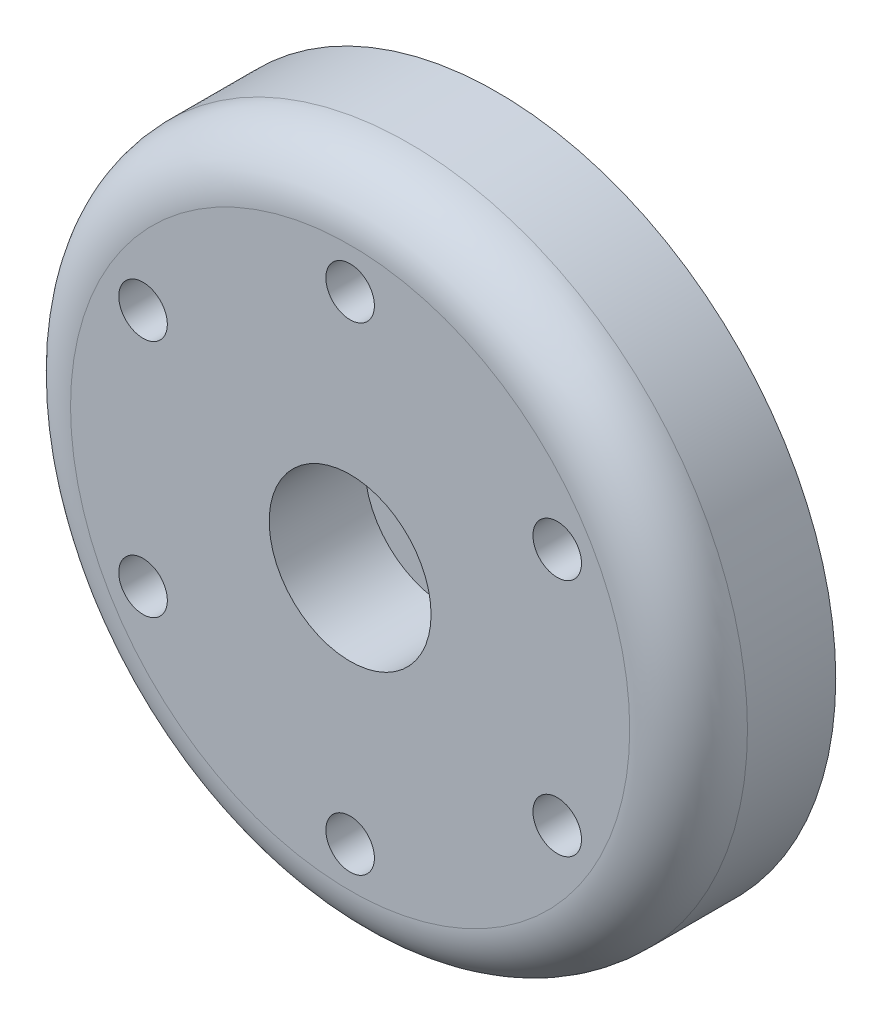
ISO-10303-21;
HEADER;
FILE_DESCRIPTION(('STEP AP214'),'2;1');
FILE_NAME('part.step','',(''),(''),'','','');
FILE_SCHEMA(('AUTOMOTIVE_DESIGN { 1 0 10303 214 1 1 1 1 }'));
ENDSEC;
DATA;
#1=APPLICATION_CONTEXT('core data for automotive mechanical design processes');
#2=APPLICATION_PROTOCOL_DEFINITION('international standard','automotive_design',2000,#1);
#3=PRODUCT_CONTEXT('',#1,'mechanical');
#4=PRODUCT('Part','Part','',(#3));
#5=PRODUCT_RELATED_PRODUCT_CATEGORY('part','',(#4));
#6=PRODUCT_DEFINITION_FORMATION('','',#4);
#7=PRODUCT_DEFINITION_CONTEXT('part definition',#1,'design');
#8=PRODUCT_DEFINITION('design','',#6,#7);
#9=PRODUCT_DEFINITION_SHAPE('','',#8);
#10=(LENGTH_UNIT() NAMED_UNIT(*) SI_UNIT(.MILLI.,.METRE.));
#11=(NAMED_UNIT(*) PLANE_ANGLE_UNIT() SI_UNIT($,.RADIAN.));
#12=(NAMED_UNIT(*) SI_UNIT($,.STERADIAN.) SOLID_ANGLE_UNIT());
#13=UNCERTAINTY_MEASURE_WITH_UNIT(LENGTH_MEASURE(1.E-05),#10,'distance_accuracy_value','');
#14=(GEOMETRIC_REPRESENTATION_CONTEXT(3) GLOBAL_UNCERTAINTY_ASSIGNED_CONTEXT((#13)) GLOBAL_UNIT_ASSIGNED_CONTEXT((#10,
#11,#12)) REPRESENTATION_CONTEXT('',''));
#15=CARTESIAN_POINT('',(0.,0.,0.));
#16=DIRECTION('',(0.,0.,1.));
#17=DIRECTION('',(1.,0.,0.));
#18=AXIS2_PLACEMENT_3D('',#15,#16,#17);
#19=CARTESIAN_POINT('',(0.,0.,10.));
#20=DIRECTION('',(0.,0.,-1.));
#21=DIRECTION('',(-1.,0.,0.));
#22=AXIS2_PLACEMENT_3D('',#19,#20,#21);
#23=CYLINDRICAL_SURFACE('',#22,23.);
#24=CARTESIAN_POINT('',(0.,0.,6.));
#25=DIRECTION('',(0.,0.,1.));
#26=DIRECTION('',(1.,0.,0.));
#27=AXIS2_PLACEMENT_3D('',#24,#25,#26);
#28=CIRCLE('',#27,23.);
#29=CARTESIAN_POINT('',(23.,0.,6.));
#30=VERTEX_POINT('',#29);
#31=EDGE_CURVE('E52',#30,#30,#28,.F.);
#32=ORIENTED_EDGE('',*,*,#31,.T.);
#33=EDGE_LOOP('',(#32));
#34=FACE_BOUND('',#33,.T.);
#35=CARTESIAN_POINT('',(0.,0.,0.));
#36=DIRECTION('',(0.,0.,-1.));
#37=DIRECTION('',(-1.,0.,0.));
#38=AXIS2_PLACEMENT_3D('',#35,#36,#37);
#39=CIRCLE('',#38,23.);
#40=CARTESIAN_POINT('',(-23.,0.,0.));
#41=VERTEX_POINT('',#40);
#42=EDGE_CURVE('E59',#41,#41,#39,.T.);
#43=ORIENTED_EDGE('',*,*,#42,.F.);
#44=EDGE_LOOP('',(#43));
#45=FACE_BOUND('',#44,.T.);
#46=ADVANCED_FACE('F44',(#34,#45),#23,.T.);
#47=CARTESIAN_POINT('',(23.,0.,10.));
#48=DIRECTION('',(0.,0.,1.));
#49=DIRECTION('',(1.,0.,0.));
#50=AXIS2_PLACEMENT_3D('',#47,#48,#49);
#51=PLANE('',#50);
#52=CARTESIAN_POINT('',(0.,0.,10.));
#53=DIRECTION('',(0.,0.,1.));
#54=DIRECTION('',(1.,0.,0.));
#55=AXIS2_PLACEMENT_3D('',#52,#53,#54);
#56=CIRCLE('',#55,19.);
#57=CARTESIAN_POINT('',(19.,0.,10.));
#58=VERTEX_POINT('',#57);
#59=EDGE_CURVE('E10',#58,#58,#56,.T.);
#60=ORIENTED_EDGE('',*,*,#59,.T.);
#61=EDGE_LOOP('',(#60));
#62=FACE_BOUND('',#61,.T.);
#63=CARTESIAN_POINT('',(0.,0.,10.));
#64=DIRECTION('',(0.,0.,1.));
#65=DIRECTION('',(1.,0.,0.));
#66=AXIS2_PLACEMENT_3D('',#63,#64,#65);
#67=CIRCLE('',#66,5.5);
#68=CARTESIAN_POINT('',(5.5,0.,10.));
#69=VERTEX_POINT('',#68);
#70=EDGE_CURVE('E144',#69,#69,#67,.T.);
#71=ORIENTED_EDGE('',*,*,#70,.F.);
#72=EDGE_LOOP('',(#71));
#73=FACE_BOUND('',#72,.T.);
#74=CARTESIAN_POINT('',(14.072912811497,8.12500000000017,10.));
#75=DIRECTION('',(0.,0.,-1.));
#76=DIRECTION('',(-1.,0.,0.));
#77=AXIS2_PLACEMENT_3D('',#74,#75,#76);
#78=CIRCLE('',#77,1.65);
#79=CARTESIAN_POINT('',(12.422912811497,8.12500000000017,10.));
#80=VERTEX_POINT('',#79);
#81=EDGE_CURVE('E124',#80,#80,#78,.T.);
#82=ORIENTED_EDGE('',*,*,#81,.T.);
#83=EDGE_LOOP('',(#82));
#84=FACE_BOUND('',#83,.T.);
#85=CARTESIAN_POINT('',(14.0729128114971,-8.12500000000001,10.));
#86=DIRECTION('',(0.,0.,-1.));
#87=DIRECTION('',(-1.,0.,0.));
#88=AXIS2_PLACEMENT_3D('',#85,#86,#87);
#89=CIRCLE('',#88,1.65);
#90=CARTESIAN_POINT('',(12.4229128114971,-8.12500000000001,10.));
#91=VERTEX_POINT('',#90);
#92=EDGE_CURVE('E116',#91,#91,#89,.T.);
#93=ORIENTED_EDGE('',*,*,#92,.T.);
#94=EDGE_LOOP('',(#93));
#95=FACE_BOUND('',#94,.T.);
#96=CARTESIAN_POINT('',(1.13473143512402E-13,-16.25,10.));
#97=DIRECTION('',(0.,0.,-1.));
#98=DIRECTION('',(-1.,0.,0.));
#99=AXIS2_PLACEMENT_3D('',#96,#97,#98);
#100=CIRCLE('',#99,1.65);
#101=CARTESIAN_POINT('',(-1.64999999999989,-16.25,10.));
#102=VERTEX_POINT('',#101);
#103=EDGE_CURVE('E108',#102,#102,#100,.T.);
#104=ORIENTED_EDGE('',*,*,#103,.T.);
#105=EDGE_LOOP('',(#104));
#106=FACE_BOUND('',#105,.T.);
#107=CARTESIAN_POINT('',(-14.0729128114971,-8.12500000000007,10.));
#108=DIRECTION('',(0.,0.,-1.));
#109=DIRECTION('',(-1.,0.,0.));
#110=AXIS2_PLACEMENT_3D('',#107,#108,#109);
#111=CIRCLE('',#110,1.65);
#112=CARTESIAN_POINT('',(-15.7229128114971,-8.12500000000007,10.));
#113=VERTEX_POINT('',#112);
#114=EDGE_CURVE('E100',#113,#113,#111,.T.);
#115=ORIENTED_EDGE('',*,*,#114,.T.);
#116=EDGE_LOOP('',(#115));
#117=FACE_BOUND('',#116,.T.);
#118=CARTESIAN_POINT('',(-14.0729128114972,8.12499999999998,10.));
#119=DIRECTION('',(0.,0.,-1.));
#120=DIRECTION('',(-1.,0.,0.));
#121=AXIS2_PLACEMENT_3D('',#118,#119,#120);
#122=CIRCLE('',#121,1.65);
#123=CARTESIAN_POINT('',(-15.7229128114972,8.12499999999998,10.));
#124=VERTEX_POINT('',#123);
#125=EDGE_CURVE('E92',#124,#124,#122,.T.);
#126=ORIENTED_EDGE('',*,*,#125,.T.);
#127=EDGE_LOOP('',(#126));
#128=FACE_BOUND('',#127,.T.);
#129=CARTESIAN_POINT('',(0.,16.25,10.));
#130=DIRECTION('',(0.,0.,-1.));
#131=DIRECTION('',(-1.,0.,0.));
#132=AXIS2_PLACEMENT_3D('',#129,#130,#131);
#133=CIRCLE('',#132,1.65);
#134=CARTESIAN_POINT('',(-1.65,16.25,10.));
#135=VERTEX_POINT('',#134);
#136=EDGE_CURVE('E84',#135,#135,#133,.T.);
#137=ORIENTED_EDGE('',*,*,#136,.T.);
#138=EDGE_LOOP('',(#137));
#139=FACE_BOUND('',#138,.T.);
#140=ADVANCED_FACE('F153',(#62,#73,#84,#95,#106,#117,#128,#139),#51,.T.);
#141=CARTESIAN_POINT('',(0.,0.,0.));
#142=DIRECTION('',(0.,0.,-1.));
#143=DIRECTION('',(-1.,0.,0.));
#144=AXIS2_PLACEMENT_3D('',#141,#142,#143);
#145=PLANE('',#144);
#146=CARTESIAN_POINT('',(0.,0.,0.));
#147=DIRECTION('',(0.,0.,-1.));
#148=DIRECTION('',(-1.,0.,0.));
#149=AXIS2_PLACEMENT_3D('',#146,#147,#148);
#150=CIRCLE('',#149,20.);
#151=CARTESIAN_POINT('',(-20.,0.,0.));
#152=VERTEX_POINT('',#151);
#153=EDGE_CURVE('E72',#152,#152,#150,.T.);
#154=ORIENTED_EDGE('',*,*,#153,.F.);
#155=EDGE_LOOP('',(#154));
#156=FACE_BOUND('',#155,.T.);
#157=ORIENTED_EDGE('',*,*,#42,.T.);
#158=EDGE_LOOP('',(#157));
#159=FACE_BOUND('',#158,.T.);
#160=ADVANCED_FACE('F156',(#156,#159),#145,.T.);
#161=CARTESIAN_POINT('',(0.,0.,5.8));
#162=DIRECTION('',(0.,0.,1.));
#163=DIRECTION('',(1.,0.,0.));
#164=AXIS2_PLACEMENT_3D('',#161,#162,#163);
#165=PLANE('',#164);
#166=CARTESIAN_POINT('',(14.072912811497,8.12500000000017,5.8));
#167=DIRECTION('',(0.,0.,-1.));
#168=DIRECTION('',(-1.,0.,0.));
#169=AXIS2_PLACEMENT_3D('',#166,#167,#168);
#170=CIRCLE('',#169,1.65);
#171=CARTESIAN_POINT('',(12.422912811497,8.12500000000017,5.8));
#172=VERTEX_POINT('',#171);
#173=EDGE_CURVE('E128',#172,#172,#170,.T.);
#174=ORIENTED_EDGE('',*,*,#173,.F.);
#175=EDGE_LOOP('',(#174));
#176=FACE_BOUND('',#175,.T.);
#177=CARTESIAN_POINT('',(14.0729128114971,-8.12500000000001,5.8));
#178=DIRECTION('',(0.,0.,-1.));
#179=DIRECTION('',(-1.,0.,0.));
#180=AXIS2_PLACEMENT_3D('',#177,#178,#179);
#181=CIRCLE('',#180,1.65);
#182=CARTESIAN_POINT('',(12.4229128114971,-8.12500000000001,5.8));
#183=VERTEX_POINT('',#182);
#184=EDGE_CURVE('E120',#183,#183,#181,.T.);
#185=ORIENTED_EDGE('',*,*,#184,.F.);
#186=EDGE_LOOP('',(#185));
#187=FACE_BOUND('',#186,.T.);
#188=CARTESIAN_POINT('',(1.13473143512402E-13,-16.25,5.8));
#189=DIRECTION('',(0.,0.,-1.));
#190=DIRECTION('',(-1.,0.,0.));
#191=AXIS2_PLACEMENT_3D('',#188,#189,#190);
#192=CIRCLE('',#191,1.65);
#193=CARTESIAN_POINT('',(-1.64999999999989,-16.25,5.8));
#194=VERTEX_POINT('',#193);
#195=EDGE_CURVE('E112',#194,#194,#192,.T.);
#196=ORIENTED_EDGE('',*,*,#195,.F.);
#197=EDGE_LOOP('',(#196));
#198=FACE_BOUND('',#197,.T.);
#199=CARTESIAN_POINT('',(-14.0729128114971,-8.12500000000007,5.8));
#200=DIRECTION('',(0.,0.,-1.));
#201=DIRECTION('',(-1.,0.,0.));
#202=AXIS2_PLACEMENT_3D('',#199,#200,#201);
#203=CIRCLE('',#202,1.65);
#204=CARTESIAN_POINT('',(-15.7229128114971,-8.12500000000007,5.8));
#205=VERTEX_POINT('',#204);
#206=EDGE_CURVE('E104',#205,#205,#203,.T.);
#207=ORIENTED_EDGE('',*,*,#206,.F.);
#208=EDGE_LOOP('',(#207));
#209=FACE_BOUND('',#208,.T.);
#210=CARTESIAN_POINT('',(-14.0729128114972,8.12499999999998,5.8));
#211=DIRECTION('',(0.,0.,-1.));
#212=DIRECTION('',(-1.,0.,0.));
#213=AXIS2_PLACEMENT_3D('',#210,#211,#212);
#214=CIRCLE('',#213,1.65);
#215=CARTESIAN_POINT('',(-15.7229128114972,8.12499999999998,5.8));
#216=VERTEX_POINT('',#215);
#217=EDGE_CURVE('E96',#216,#216,#214,.T.);
#218=ORIENTED_EDGE('',*,*,#217,.F.);
#219=EDGE_LOOP('',(#218));
#220=FACE_BOUND('',#219,.T.);
#221=CARTESIAN_POINT('',(0.,16.25,5.8));
#222=DIRECTION('',(0.,0.,-1.));
#223=DIRECTION('',(-1.,0.,0.));
#224=AXIS2_PLACEMENT_3D('',#221,#222,#223);
#225=CIRCLE('',#224,1.65);
#226=CARTESIAN_POINT('',(-1.65,16.25,5.8));
#227=VERTEX_POINT('',#226);
#228=EDGE_CURVE('E88',#227,#227,#225,.T.);
#229=ORIENTED_EDGE('',*,*,#228,.F.);
#230=EDGE_LOOP('',(#229));
#231=FACE_BOUND('',#230,.T.);
#232=CARTESIAN_POINT('',(0.,0.,5.8));
#233=DIRECTION('',(0.,0.,-1.));
#234=DIRECTION('',(-1.,0.,0.));
#235=AXIS2_PLACEMENT_3D('',#232,#233,#234);
#236=CIRCLE('',#235,12.5);
#237=CARTESIAN_POINT('',(-12.5,0.,5.8));
#238=VERTEX_POINT('',#237);
#239=EDGE_CURVE('E76',#238,#238,#236,.T.);
#240=ORIENTED_EDGE('',*,*,#239,.F.);
#241=EDGE_LOOP('',(#240));
#242=FACE_BOUND('',#241,.T.);
#243=CARTESIAN_POINT('',(0.,0.,5.8));
#244=DIRECTION('',(0.,0.,-1.));
#245=DIRECTION('',(-1.,0.,0.));
#246=AXIS2_PLACEMENT_3D('',#243,#244,#245);
#247=CIRCLE('',#246,20.);
#248=CARTESIAN_POINT('',(-20.,0.,5.8));
#249=VERTEX_POINT('',#248);
#250=EDGE_CURVE('E66',#249,#249,#247,.T.);
#251=ORIENTED_EDGE('',*,*,#250,.T.);
#252=EDGE_LOOP('',(#251));
#253=FACE_BOUND('',#252,.T.);
#254=ADVANCED_FACE('F178',(#176,#187,#198,#209,#220,#231,#242,#253),#165,.F.);
#255=CARTESIAN_POINT('',(0.,0.,0.));
#256=DIRECTION('',(0.,0.,-1.));
#257=DIRECTION('',(-1.,0.,0.));
#258=AXIS2_PLACEMENT_3D('',#255,#256,#257);
#259=CYLINDRICAL_SURFACE('',#258,20.);
#260=ORIENTED_EDGE('',*,*,#250,.F.);
#261=EDGE_LOOP('',(#260));
#262=FACE_BOUND('',#261,.T.);
#263=ORIENTED_EDGE('',*,*,#153,.T.);
#264=EDGE_LOOP('',(#263));
#265=FACE_BOUND('',#264,.T.);
#266=ADVANCED_FACE('F181',(#262,#265),#259,.F.);
#267=CARTESIAN_POINT('',(0.,0.,5.8));
#268=DIRECTION('',(0.,0.,-1.));
#269=DIRECTION('',(-1.,0.,0.));
#270=AXIS2_PLACEMENT_3D('',#267,#268,#269);
#271=CYLINDRICAL_SURFACE('',#270,12.5);
#272=ORIENTED_EDGE('',*,*,#239,.T.);
#273=EDGE_LOOP('',(#272));
#274=FACE_BOUND('',#273,.T.);
#275=CARTESIAN_POINT('',(0.,0.,0.));
#276=DIRECTION('',(0.,0.,-1.));
#277=DIRECTION('',(-1.,0.,0.));
#278=AXIS2_PLACEMENT_3D('',#275,#276,#277);
#279=CIRCLE('',#278,12.5);
#280=CARTESIAN_POINT('',(-12.5,0.,0.));
#281=VERTEX_POINT('',#280);
#282=EDGE_CURVE('E80',#281,#281,#279,.T.);
#283=ORIENTED_EDGE('',*,*,#282,.F.);
#284=EDGE_LOOP('',(#283));
#285=FACE_BOUND('',#284,.T.);
#286=ADVANCED_FACE('F190',(#274,#285),#271,.T.);
#287=CARTESIAN_POINT('',(0.,0.,0.));
#288=DIRECTION('',(0.,0.,-1.));
#289=DIRECTION('',(-1.,0.,0.));
#290=AXIS2_PLACEMENT_3D('',#287,#288,#289);
#291=PLANE('',#290);
#292=CARTESIAN_POINT('',(0.,0.,0.));
#293=DIRECTION('',(0.,0.,1.));
#294=DIRECTION('',(1.,0.,0.));
#295=AXIS2_PLACEMENT_3D('',#292,#293,#294);
#296=CIRCLE('',#295,3.5);
#297=CARTESIAN_POINT('',(3.5,0.,0.));
#298=VERTEX_POINT('',#297);
#299=EDGE_CURVE('E132',#298,#298,#296,.T.);
#300=ORIENTED_EDGE('',*,*,#299,.T.);
#301=EDGE_LOOP('',(#300));
#302=FACE_BOUND('',#301,.T.);
#303=ORIENTED_EDGE('',*,*,#282,.T.);
#304=EDGE_LOOP('',(#303));
#305=FACE_BOUND('',#304,.T.);
#306=ADVANCED_FACE('F174',(#302,#305),#291,.T.);
#307=CARTESIAN_POINT('',(0.,16.25,5.8));
#308=DIRECTION('',(0.,0.,-1.));
#309=DIRECTION('',(-1.,0.,0.));
#310=AXIS2_PLACEMENT_3D('',#307,#308,#309);
#311=CYLINDRICAL_SURFACE('',#310,1.65);
#312=ORIENTED_EDGE('',*,*,#136,.F.);
#313=EDGE_LOOP('',(#312));
#314=FACE_BOUND('',#313,.T.);
#315=ORIENTED_EDGE('',*,*,#228,.T.);
#316=EDGE_LOOP('',(#315));
#317=FACE_BOUND('',#316,.T.);
#318=ADVANCED_FACE('F170',(#314,#317),#311,.F.);
#319=CARTESIAN_POINT('',(-14.0729128114972,8.12499999999998,5.8));
#320=DIRECTION('',(0.,0.,-1.));
#321=DIRECTION('',(-1.,0.,0.));
#322=AXIS2_PLACEMENT_3D('',#319,#320,#321);
#323=CYLINDRICAL_SURFACE('',#322,1.65);
#324=ORIENTED_EDGE('',*,*,#125,.F.);
#325=EDGE_LOOP('',(#324));
#326=FACE_BOUND('',#325,.T.);
#327=ORIENTED_EDGE('',*,*,#217,.T.);
#328=EDGE_LOOP('',(#327));
#329=FACE_BOUND('',#328,.T.);
#330=ADVANCED_FACE('F173',(#326,#329),#323,.F.);
#331=CARTESIAN_POINT('',(-14.0729128114971,-8.12500000000007,5.8));
#332=DIRECTION('',(0.,0.,-1.));
#333=DIRECTION('',(-1.,0.,0.));
#334=AXIS2_PLACEMENT_3D('',#331,#332,#333);
#335=CYLINDRICAL_SURFACE('',#334,1.65);
#336=ORIENTED_EDGE('',*,*,#114,.F.);
#337=EDGE_LOOP('',(#336));
#338=FACE_BOUND('',#337,.T.);
#339=ORIENTED_EDGE('',*,*,#206,.T.);
#340=EDGE_LOOP('',(#339));
#341=FACE_BOUND('',#340,.T.);
#342=ADVANCED_FACE('F211',(#338,#341),#335,.F.);
#343=CARTESIAN_POINT('',(1.13473143512402E-13,-16.25,5.8));
#344=DIRECTION('',(0.,0.,-1.));
#345=DIRECTION('',(-1.,0.,0.));
#346=AXIS2_PLACEMENT_3D('',#343,#344,#345);
#347=CYLINDRICAL_SURFACE('',#346,1.65);
#348=ORIENTED_EDGE('',*,*,#103,.F.);
#349=EDGE_LOOP('',(#348));
#350=FACE_BOUND('',#349,.T.);
#351=ORIENTED_EDGE('',*,*,#195,.T.);
#352=EDGE_LOOP('',(#351));
#353=FACE_BOUND('',#352,.T.);
#354=ADVANCED_FACE('F215',(#350,#353),#347,.F.);
#355=CARTESIAN_POINT('',(14.0729128114971,-8.12500000000001,5.8));
#356=DIRECTION('',(0.,0.,-1.));
#357=DIRECTION('',(-1.,0.,0.));
#358=AXIS2_PLACEMENT_3D('',#355,#356,#357);
#359=CYLINDRICAL_SURFACE('',#358,1.65);
#360=ORIENTED_EDGE('',*,*,#92,.F.);
#361=EDGE_LOOP('',(#360));
#362=FACE_BOUND('',#361,.T.);
#363=ORIENTED_EDGE('',*,*,#184,.T.);
#364=EDGE_LOOP('',(#363));
#365=FACE_BOUND('',#364,.T.);
#366=ADVANCED_FACE('F219',(#362,#365),#359,.F.);
#367=CARTESIAN_POINT('',(14.072912811497,8.12500000000017,5.8));
#368=DIRECTION('',(0.,0.,-1.));
#369=DIRECTION('',(-1.,0.,0.));
#370=AXIS2_PLACEMENT_3D('',#367,#368,#369);
#371=CYLINDRICAL_SURFACE('',#370,1.65);
#372=ORIENTED_EDGE('',*,*,#81,.F.);
#373=EDGE_LOOP('',(#372));
#374=FACE_BOUND('',#373,.T.);
#375=ORIENTED_EDGE('',*,*,#173,.T.);
#376=EDGE_LOOP('',(#375));
#377=FACE_BOUND('',#376,.T.);
#378=ADVANCED_FACE('F223',(#374,#377),#371,.F.);
#379=CARTESIAN_POINT('',(0.,0.,10.));
#380=DIRECTION('',(0.,0.,1.));
#381=DIRECTION('',(1.,0.,0.));
#382=AXIS2_PLACEMENT_3D('',#379,#380,#381);
#383=CYLINDRICAL_SURFACE('',#382,3.5);
#384=ORIENTED_EDGE('',*,*,#299,.F.);
#385=EDGE_LOOP('',(#384));
#386=FACE_BOUND('',#385,.T.);
#387=CARTESIAN_POINT('',(0.,0.,3.5));
#388=DIRECTION('',(0.,0.,1.));
#389=DIRECTION('',(1.,0.,0.));
#390=AXIS2_PLACEMENT_3D('',#387,#388,#389);
#391=CIRCLE('',#390,3.5);
#392=CARTESIAN_POINT('',(3.5,0.,3.5));
#393=VERTEX_POINT('',#392);
#394=EDGE_CURVE('E136',#393,#393,#391,.T.);
#395=ORIENTED_EDGE('',*,*,#394,.T.);
#396=EDGE_LOOP('',(#395));
#397=FACE_BOUND('',#396,.T.);
#398=ADVANCED_FACE('F227',(#386,#397),#383,.F.);
#399=CARTESIAN_POINT('',(3.5,0.,3.5));
#400=DIRECTION('',(0.,0.,-1.));
#401=DIRECTION('',(-1.,0.,0.));
#402=AXIS2_PLACEMENT_3D('',#399,#400,#401);
#403=PLANE('',#402);
#404=ORIENTED_EDGE('',*,*,#394,.F.);
#405=EDGE_LOOP('',(#404));
#406=FACE_BOUND('',#405,.T.);
#407=CARTESIAN_POINT('',(0.,0.,3.5));
#408=DIRECTION('',(0.,0.,1.));
#409=DIRECTION('',(1.,0.,0.));
#410=AXIS2_PLACEMENT_3D('',#407,#408,#409);
#411=CIRCLE('',#410,5.5);
#412=CARTESIAN_POINT('',(5.5,0.,3.5));
#413=VERTEX_POINT('',#412);
#414=EDGE_CURVE('E140',#413,#413,#411,.T.);
#415=ORIENTED_EDGE('',*,*,#414,.T.);
#416=EDGE_LOOP('',(#415));
#417=FACE_BOUND('',#416,.T.);
#418=ADVANCED_FACE('F231',(#406,#417),#403,.F.);
#419=CARTESIAN_POINT('',(0.,0.,10.));
#420=DIRECTION('',(0.,0.,1.));
#421=DIRECTION('',(1.,0.,0.));
#422=AXIS2_PLACEMENT_3D('',#419,#420,#421);
#423=CYLINDRICAL_SURFACE('',#422,5.5);
#424=ORIENTED_EDGE('',*,*,#414,.F.);
#425=EDGE_LOOP('',(#424));
#426=FACE_BOUND('',#425,.T.);
#427=ORIENTED_EDGE('',*,*,#70,.T.);
#428=EDGE_LOOP('',(#427));
#429=FACE_BOUND('',#428,.T.);
#430=ADVANCED_FACE('F151',(#426,#429),#423,.F.);
#431=CARTESIAN_POINT('',(0.,0.,6.));
#432=DIRECTION('',(0.,0.,1.));
#433=DIRECTION('',(1.,0.,0.));
#434=AXIS2_PLACEMENT_3D('',#431,#432,#433);
#435=TOROIDAL_SURFACE('',#434,19.,4.);
#436=ORIENTED_EDGE('',*,*,#59,.F.);
#437=EDGE_LOOP('',(#436));
#438=FACE_BOUND('',#437,.T.);
#439=ORIENTED_EDGE('',*,*,#31,.F.);
#440=EDGE_LOOP('',(#439));
#441=FACE_BOUND('',#440,.T.);
#442=ADVANCED_FACE('F46',(#438,#441),#435,.T.);
#443=CLOSED_SHELL('',(#46,#140,#160,#254,#266,#286,#306,#318,#330,#342,#354,#366,#378,#398,#418,
#430,#442));
#444=MANIFOLD_SOLID_BREP('B2',#443);
#445=ADVANCED_BREP_SHAPE_REPRESENTATION('',(#18,#444),#14);
#446=SHAPE_DEFINITION_REPRESENTATION(#9,#445);
ENDSEC;
END-ISO-10303-21;
